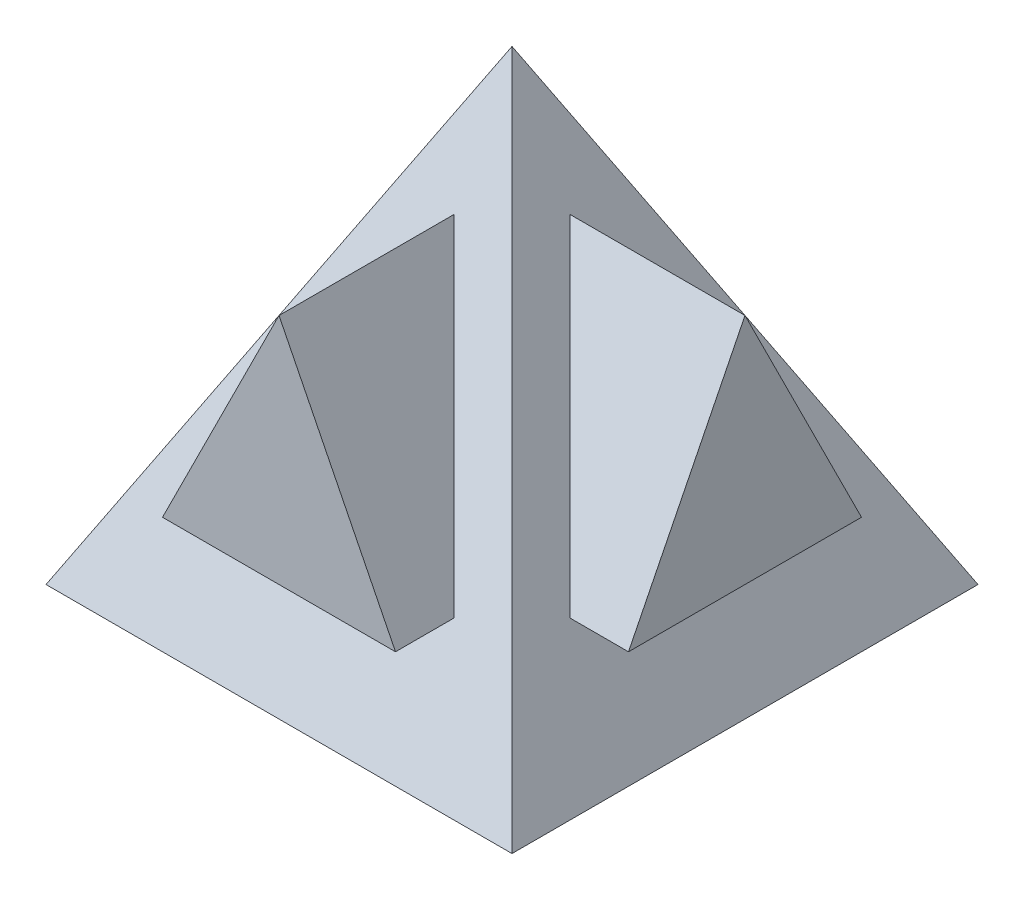
ISO-10303-21;
HEADER;
FILE_DESCRIPTION(('STEP AP214'),'2;1');
FILE_NAME('part.step','',(''),(''),'','','');
FILE_SCHEMA(('AUTOMOTIVE_DESIGN { 1 0 10303 214 1 1 1 1 }'));
ENDSEC;
DATA;
#1=APPLICATION_CONTEXT('core data for automotive mechanical design processes');
#2=APPLICATION_PROTOCOL_DEFINITION('international standard','automotive_design',2000,#1);
#3=PRODUCT_CONTEXT('',#1,'mechanical');
#4=PRODUCT('Part','Part','',(#3));
#5=PRODUCT_RELATED_PRODUCT_CATEGORY('part','',(#4));
#6=PRODUCT_DEFINITION_FORMATION('','',#4);
#7=PRODUCT_DEFINITION_CONTEXT('part definition',#1,'design');
#8=PRODUCT_DEFINITION('design','',#6,#7);
#9=PRODUCT_DEFINITION_SHAPE('','',#8);
#10=(LENGTH_UNIT() NAMED_UNIT(*) SI_UNIT(.MILLI.,.METRE.));
#11=(NAMED_UNIT(*) PLANE_ANGLE_UNIT() SI_UNIT($,.RADIAN.));
#12=(NAMED_UNIT(*) SI_UNIT($,.STERADIAN.) SOLID_ANGLE_UNIT());
#13=UNCERTAINTY_MEASURE_WITH_UNIT(LENGTH_MEASURE(1.E-05),#10,'distance_accuracy_value','');
#14=(GEOMETRIC_REPRESENTATION_CONTEXT(3) GLOBAL_UNCERTAINTY_ASSIGNED_CONTEXT((#13)) GLOBAL_UNIT_ASSIGNED_CONTEXT((#10,
#11,#12)) REPRESENTATION_CONTEXT('',''));
#15=CARTESIAN_POINT('',(0.,0.,0.));
#16=DIRECTION('',(0.,0.,1.));
#17=DIRECTION('',(1.,0.,0.));
#18=AXIS2_PLACEMENT_3D('',#15,#16,#17);
#19=CARTESIAN_POINT('',(0.,40.64,81.28));
#20=DIRECTION('',(0.,0.447213595499958,0.894427190999916));
#21=DIRECTION('',(0.,-0.894427190999916,0.447213595499958));
#22=AXIS2_PLACEMENT_3D('',#19,#20,#21);
#23=PLANE('',#22);
#24=DIRECTION('',(-0.408248290463863,-0.816496580927726,0.408248290463863));
#25=VECTOR('',#24,1.);
#26=CARTESIAN_POINT('',(0.,203.2,0.));
#27=LINE('',#26,#25);
#28=CARTESIAN_POINT('',(0.,203.2,0.));
#29=VERTEX_POINT('',#28);
#30=CARTESIAN_POINT('',(-101.6,0.,101.6));
#31=VERTEX_POINT('',#30);
#32=EDGE_CURVE('E163',#29,#31,#27,.T.);
#33=ORIENTED_EDGE('',*,*,#32,.T.);
#34=DIRECTION('',(1.,0.,0.));
#35=VECTOR('',#34,1.);
#36=CARTESIAN_POINT('',(101.6,0.,101.6));
#37=LINE('',#36,#35);
#38=CARTESIAN_POINT('',(101.6,0.,101.6));
#39=VERTEX_POINT('',#38);
#40=EDGE_CURVE('E157',#31,#39,#37,.T.);
#41=ORIENTED_EDGE('',*,*,#40,.T.);
#42=DIRECTION('',(0.408248290463863,-0.816496580927726,0.408248290463863));
#43=VECTOR('',#42,1.);
#44=CARTESIAN_POINT('',(0.,203.2,0.));
#45=LINE('',#44,#43);
#46=EDGE_CURVE('E151',#29,#39,#45,.T.);
#47=ORIENTED_EDGE('',*,*,#46,.F.);
#48=EDGE_LOOP('',(#33,#41,#47));
#49=FACE_BOUND('',#48,.T.);
#50=DIRECTION('',(0.408248290463863,0.816496580927726,-0.408248290463863));
#51=VECTOR('',#50,1.);
#52=CARTESIAN_POINT('',(-46.5666666666666,59.2666666666667,71.9666666666667));
#53=LINE('',#52,#51);
#54=CARTESIAN_POINT('',(-50.8,50.8,76.2));
#55=VERTEX_POINT('',#54);
#56=CARTESIAN_POINT('',(0.,152.4,25.4));
#57=VERTEX_POINT('',#56);
#58=EDGE_CURVE('E50',#55,#57,#53,.T.);
#59=ORIENTED_EDGE('',*,*,#58,.T.);
#60=DIRECTION('',(0.408248290463863,-0.816496580927726,0.408248290463863));
#61=VECTOR('',#60,1.);
#62=CARTESIAN_POINT('',(46.5666666666667,59.2666666666667,71.9666666666667));
#63=LINE('',#62,#61);
#64=CARTESIAN_POINT('',(50.8,50.8,76.2));
#65=VERTEX_POINT('',#64);
#66=EDGE_CURVE('E12',#57,#65,#63,.T.);
#67=ORIENTED_EDGE('',*,*,#66,.T.);
#68=DIRECTION('',(-1.,0.,0.));
#69=VECTOR('',#68,1.);
#70=CARTESIAN_POINT('',(0.,50.8,76.2));
#71=LINE('',#70,#69);
#72=EDGE_CURVE('E148',#65,#55,#71,.T.);
#73=ORIENTED_EDGE('',*,*,#72,.T.);
#74=EDGE_LOOP('',(#59,#67,#73));
#75=FACE_BOUND('',#74,.T.);
#76=ADVANCED_FACE('F41',(#49,#75),#23,.T.);
#77=CARTESIAN_POINT('',(81.28,40.64,0.));
#78=DIRECTION('',(0.894427190999916,0.447213595499958,0.));
#79=DIRECTION('',(-0.447213595499958,0.894427190999916,0.));
#80=AXIS2_PLACEMENT_3D('',#77,#78,#79);
#81=PLANE('',#80);
#82=ORIENTED_EDGE('',*,*,#46,.T.);
#83=DIRECTION('',(0.,0.,-1.));
#84=VECTOR('',#83,1.);
#85=CARTESIAN_POINT('',(101.6,0.,101.6));
#86=LINE('',#85,#84);
#87=CARTESIAN_POINT('',(101.6,0.,-101.6));
#88=VERTEX_POINT('',#87);
#89=EDGE_CURVE('E199',#39,#88,#86,.T.);
#90=ORIENTED_EDGE('',*,*,#89,.T.);
#91=DIRECTION('',(0.408248290463863,-0.816496580927726,-0.408248290463863));
#92=VECTOR('',#91,1.);
#93=CARTESIAN_POINT('',(0.,203.2,0.));
#94=LINE('',#93,#92);
#95=EDGE_CURVE('E186',#29,#88,#94,.T.);
#96=ORIENTED_EDGE('',*,*,#95,.F.);
#97=EDGE_LOOP('',(#82,#90,#96));
#98=FACE_BOUND('',#97,.T.);
#99=DIRECTION('',(0.408248290463863,-0.816496580927725,-0.408248290463864));
#100=VECTOR('',#99,1.);
#101=CARTESIAN_POINT('',(71.9666666666666,59.2666666666668,-46.5666666666668));
#102=LINE('',#101,#100);
#103=CARTESIAN_POINT('',(25.4,152.4,0.));
#104=VERTEX_POINT('',#103);
#105=CARTESIAN_POINT('',(76.2,50.8,-50.8000000000003));
#106=VERTEX_POINT('',#105);
#107=EDGE_CURVE('E129',#104,#106,#102,.T.);
#108=ORIENTED_EDGE('',*,*,#107,.T.);
#109=DIRECTION('',(0.,0.,1.));
#110=VECTOR('',#109,1.);
#111=CARTESIAN_POINT('',(76.2,50.8,0.));
#112=LINE('',#111,#110);
#113=CARTESIAN_POINT('',(76.2,50.8,50.7999999999997));
#114=VERTEX_POINT('',#113);
#115=EDGE_CURVE('E269',#106,#114,#112,.T.);
#116=ORIENTED_EDGE('',*,*,#115,.T.);
#117=DIRECTION('',(-0.408248290463863,0.816496580927727,-0.408248290463862));
#118=VECTOR('',#117,1.);
#119=CARTESIAN_POINT('',(71.9666666666668,59.2666666666665,46.5666666666665));
#120=LINE('',#119,#118);
#121=EDGE_CURVE('E267',#114,#104,#120,.T.);
#122=ORIENTED_EDGE('',*,*,#121,.T.);
#123=EDGE_LOOP('',(#108,#116,#122));
#124=FACE_BOUND('',#123,.T.);
#125=ADVANCED_FACE('F43',(#98,#124),#81,.T.);
#126=CARTESIAN_POINT('',(0.,0.,0.));
#127=DIRECTION('',(0.,1.,0.));
#128=DIRECTION('',(0.,0.,1.));
#129=AXIS2_PLACEMENT_3D('',#126,#127,#128);
#130=PLANE('',#129);
#131=DIRECTION('',(0.,0.,1.));
#132=VECTOR('',#131,1.);
#133=CARTESIAN_POINT('',(-101.6,0.,101.6));
#134=LINE('',#133,#132);
#135=CARTESIAN_POINT('',(-101.6,0.,-101.6));
#136=VERTEX_POINT('',#135);
#137=EDGE_CURVE('E254',#136,#31,#134,.T.);
#138=ORIENTED_EDGE('',*,*,#137,.F.);
#139=DIRECTION('',(-1.,0.,0.));
#140=VECTOR('',#139,1.);
#141=CARTESIAN_POINT('',(101.6,0.,-101.6));
#142=LINE('',#141,#140);
#143=EDGE_CURVE('E247',#88,#136,#142,.T.);
#144=ORIENTED_EDGE('',*,*,#143,.F.);
#145=ORIENTED_EDGE('',*,*,#89,.F.);
#146=ORIENTED_EDGE('',*,*,#40,.F.);
#147=EDGE_LOOP('',(#138,#144,#145,#146));
#148=FACE_BOUND('',#147,.T.);
#149=ADVANCED_FACE('F224',(#148),#130,.F.);
#150=CARTESIAN_POINT('',(-81.28,40.64,0.));
#151=DIRECTION('',(-0.894427190999916,0.447213595499958,0.));
#152=DIRECTION('',(-0.447213595499958,-0.894427190999916,0.));
#153=AXIS2_PLACEMENT_3D('',#150,#151,#152);
#154=PLANE('',#153);
#155=DIRECTION('',(-0.408248290463863,-0.816496580927726,-0.408248290463863));
#156=VECTOR('',#155,1.);
#157=CARTESIAN_POINT('',(0.,203.2,0.));
#158=LINE('',#157,#156);
#159=EDGE_CURVE('E194',#29,#136,#158,.T.);
#160=ORIENTED_EDGE('',*,*,#159,.T.);
#161=ORIENTED_EDGE('',*,*,#137,.T.);
#162=ORIENTED_EDGE('',*,*,#32,.F.);
#163=EDGE_LOOP('',(#160,#161,#162));
#164=FACE_BOUND('',#163,.T.);
#165=ADVANCED_FACE('F173',(#164),#154,.T.);
#166=CARTESIAN_POINT('',(0.,40.64,-81.28));
#167=DIRECTION('',(0.,0.447213595499958,-0.894427190999916));
#168=DIRECTION('',(0.,0.894427190999916,0.447213595499958));
#169=AXIS2_PLACEMENT_3D('',#166,#167,#168);
#170=PLANE('',#169);
#171=ORIENTED_EDGE('',*,*,#95,.T.);
#172=ORIENTED_EDGE('',*,*,#143,.T.);
#173=ORIENTED_EDGE('',*,*,#159,.F.);
#174=EDGE_LOOP('',(#171,#172,#173));
#175=FACE_BOUND('',#174,.T.);
#176=ADVANCED_FACE('F176',(#175),#170,.T.);
#177=CARTESIAN_POINT('',(101.6,0.,-3.54734504026462E-13));
#178=DIRECTION('',(-1.,0.,0.));
#179=DIRECTION('',(0.,0.,1.));
#180=AXIS2_PLACEMENT_3D('',#177,#178,#179);
#181=PLANE('',#180);
#182=DIRECTION('',(0.,0.894427190999916,0.447213595499958));
#183=VECTOR('',#182,1.);
#184=CARTESIAN_POINT('',(101.6,50.8,-50.8000000000004));
#185=LINE('',#184,#183);
#186=CARTESIAN_POINT('',(101.6,50.8,-50.8000000000004));
#187=VERTEX_POINT('',#186);
#188=CARTESIAN_POINT('',(101.6,152.4,-3.5656878734471E-13));
#189=VERTEX_POINT('',#188);
#190=EDGE_CURVE('E123',#187,#189,#185,.T.);
#191=ORIENTED_EDGE('',*,*,#190,.T.);
#192=DIRECTION('',(0.,-0.894427190999916,0.447213595499958));
#193=VECTOR('',#192,1.);
#194=CARTESIAN_POINT('',(101.6,152.4,-3.5656878734471E-13));
#195=LINE('',#194,#193);
#196=CARTESIAN_POINT('',(101.6,50.8,50.7999999999996));
#197=VERTEX_POINT('',#196);
#198=EDGE_CURVE('E112',#189,#197,#195,.T.);
#199=ORIENTED_EDGE('',*,*,#198,.T.);
#200=DIRECTION('',(0.,0.,-1.));
#201=VECTOR('',#200,1.);
#202=CARTESIAN_POINT('',(101.6,50.8,50.7999999999996));
#203=LINE('',#202,#201);
#204=EDGE_CURVE('E122',#197,#187,#203,.T.);
#205=ORIENTED_EDGE('',*,*,#204,.T.);
#206=EDGE_LOOP('',(#191,#199,#205));
#207=FACE_BOUND('',#206,.T.);
#208=ADVANCED_FACE('F125',(#207),#181,.F.);
#209=CARTESIAN_POINT('',(101.6,50.8,-50.8000000000004));
#210=DIRECTION('',(0.,-0.447213595499958,0.894427190999916));
#211=DIRECTION('',(0.,-0.894427190999916,-0.447213595499958));
#212=AXIS2_PLACEMENT_3D('',#209,#210,#211);
#213=PLANE('',#212);
#214=ORIENTED_EDGE('',*,*,#107,.F.);
#215=DIRECTION('',(-1.,0.,0.));
#216=VECTOR('',#215,1.);
#217=CARTESIAN_POINT('',(101.6,152.4,-3.5656878734471E-13));
#218=LINE('',#217,#216);
#219=EDGE_CURVE('E116',#189,#104,#218,.T.);
#220=ORIENTED_EDGE('',*,*,#219,.F.);
#221=ORIENTED_EDGE('',*,*,#190,.F.);
#222=DIRECTION('',(-1.,0.,0.));
#223=VECTOR('',#222,1.);
#224=CARTESIAN_POINT('',(101.6,50.8,-50.8000000000004));
#225=LINE('',#224,#223);
#226=EDGE_CURVE('E65',#187,#106,#225,.T.);
#227=ORIENTED_EDGE('',*,*,#226,.T.);
#228=EDGE_LOOP('',(#214,#220,#221,#227));
#229=FACE_BOUND('',#228,.T.);
#230=ADVANCED_FACE('F127',(#229),#213,.F.);
#231=CARTESIAN_POINT('',(101.6,152.4,-3.5656878734471E-13));
#232=DIRECTION('',(0.,-0.447213595499958,-0.894427190999916));
#233=DIRECTION('',(0.,0.894427190999916,-0.447213595499958));
#234=AXIS2_PLACEMENT_3D('',#231,#232,#233);
#235=PLANE('',#234);
#236=ORIENTED_EDGE('',*,*,#121,.F.);
#237=DIRECTION('',(-1.,0.,0.));
#238=VECTOR('',#237,1.);
#239=CARTESIAN_POINT('',(101.6,50.8,50.7999999999996));
#240=LINE('',#239,#238);
#241=EDGE_CURVE('E119',#197,#114,#240,.T.);
#242=ORIENTED_EDGE('',*,*,#241,.F.);
#243=ORIENTED_EDGE('',*,*,#198,.F.);
#244=ORIENTED_EDGE('',*,*,#219,.T.);
#245=EDGE_LOOP('',(#236,#242,#243,#244));
#246=FACE_BOUND('',#245,.T.);
#247=ADVANCED_FACE('F114',(#246),#235,.F.);
#248=CARTESIAN_POINT('',(-50.8,50.8,101.6));
#249=DIRECTION('',(0.,1.,0.));
#250=DIRECTION('',(0.,0.,1.));
#251=AXIS2_PLACEMENT_3D('',#248,#249,#250);
#252=PLANE('',#251);
#253=ORIENTED_EDGE('',*,*,#115,.F.);
#254=ORIENTED_EDGE('',*,*,#226,.F.);
#255=ORIENTED_EDGE('',*,*,#204,.F.);
#256=ORIENTED_EDGE('',*,*,#241,.T.);
#257=EDGE_LOOP('',(#253,#254,#255,#256));
#258=FACE_BOUND('',#257,.T.);
#259=ADVANCED_FACE('F290',(#258),#252,.F.);
#260=ORIENTED_EDGE('',*,*,#72,.F.);
#261=DIRECTION('',(0.,0.,-1.));
#262=VECTOR('',#261,1.);
#263=CARTESIAN_POINT('',(50.8,50.8,101.6));
#264=LINE('',#263,#262);
#265=CARTESIAN_POINT('',(50.8,50.8,101.6));
#266=VERTEX_POINT('',#265);
#267=EDGE_CURVE('E141',#266,#65,#264,.T.);
#268=ORIENTED_EDGE('',*,*,#267,.F.);
#269=DIRECTION('',(1.,0.,0.));
#270=VECTOR('',#269,1.);
#271=CARTESIAN_POINT('',(-50.8,50.8,101.6));
#272=LINE('',#271,#270);
#273=CARTESIAN_POINT('',(-50.8,50.8,101.6));
#274=VERTEX_POINT('',#273);
#275=EDGE_CURVE('E139',#274,#266,#272,.T.);
#276=ORIENTED_EDGE('',*,*,#275,.F.);
#277=DIRECTION('',(0.,0.,-1.));
#278=VECTOR('',#277,1.);
#279=CARTESIAN_POINT('',(-50.8,50.8,101.6));
#280=LINE('',#279,#278);
#281=EDGE_CURVE('E57',#274,#55,#280,.T.);
#282=ORIENTED_EDGE('',*,*,#281,.T.);
#283=EDGE_LOOP('',(#260,#268,#276,#282));
#284=FACE_BOUND('',#283,.T.);
#285=ADVANCED_FACE('F279',(#284),#252,.F.);
#286=CARTESIAN_POINT('',(50.8,50.8,101.6));
#287=DIRECTION('',(-0.894427190999916,-0.447213595499958,0.));
#288=DIRECTION('',(0.447213595499958,-0.894427190999916,0.));
#289=AXIS2_PLACEMENT_3D('',#286,#287,#288);
#290=PLANE('',#289);
#291=ORIENTED_EDGE('',*,*,#66,.F.);
#292=DIRECTION('',(0.,0.,-1.));
#293=VECTOR('',#292,1.);
#294=CARTESIAN_POINT('',(0.,152.4,101.6));
#295=LINE('',#294,#293);
#296=CARTESIAN_POINT('',(0.,152.4,101.6));
#297=VERTEX_POINT('',#296);
#298=EDGE_CURVE('E145',#297,#57,#295,.T.);
#299=ORIENTED_EDGE('',*,*,#298,.F.);
#300=DIRECTION('',(-0.447213595499958,0.894427190999916,0.));
#301=VECTOR('',#300,1.);
#302=CARTESIAN_POINT('',(50.8,50.8,101.6));
#303=LINE('',#302,#301);
#304=EDGE_CURVE('E130',#266,#297,#303,.T.);
#305=ORIENTED_EDGE('',*,*,#304,.F.);
#306=ORIENTED_EDGE('',*,*,#267,.T.);
#307=EDGE_LOOP('',(#291,#299,#305,#306));
#308=FACE_BOUND('',#307,.T.);
#309=ADVANCED_FACE('F233',(#308),#290,.F.);
#310=CARTESIAN_POINT('',(0.,152.4,101.6));
#311=DIRECTION('',(0.894427190999916,-0.447213595499958,0.));
#312=DIRECTION('',(0.447213595499958,0.894427190999916,0.));
#313=AXIS2_PLACEMENT_3D('',#310,#311,#312);
#314=PLANE('',#313);
#315=ORIENTED_EDGE('',*,*,#58,.F.);
#316=ORIENTED_EDGE('',*,*,#281,.F.);
#317=DIRECTION('',(-0.447213595499958,-0.894427190999916,0.));
#318=VECTOR('',#317,1.);
#319=CARTESIAN_POINT('',(0.,152.4,101.6));
#320=LINE('',#319,#318);
#321=EDGE_CURVE('E133',#297,#274,#320,.T.);
#322=ORIENTED_EDGE('',*,*,#321,.F.);
#323=ORIENTED_EDGE('',*,*,#298,.T.);
#324=EDGE_LOOP('',(#315,#316,#322,#323));
#325=FACE_BOUND('',#324,.T.);
#326=ADVANCED_FACE('F274',(#325),#314,.F.);
#327=CARTESIAN_POINT('',(0.,0.,101.6));
#328=DIRECTION('',(0.,0.,-1.));
#329=DIRECTION('',(-1.,0.,0.));
#330=AXIS2_PLACEMENT_3D('',#327,#328,#329);
#331=PLANE('',#330);
#332=ORIENTED_EDGE('',*,*,#304,.T.);
#333=ORIENTED_EDGE('',*,*,#321,.T.);
#334=ORIENTED_EDGE('',*,*,#275,.T.);
#335=EDGE_LOOP('',(#332,#333,#334));
#336=FACE_BOUND('',#335,.T.);
#337=ADVANCED_FACE('F281',(#336),#331,.F.);
#338=CLOSED_SHELL('',(#76,#125,#149,#165,#176,#208,#230,#247,#259,#285,#309,#326,#337));
#339=MANIFOLD_SOLID_BREP('B2',#338);
#340=ADVANCED_BREP_SHAPE_REPRESENTATION('',(#18,#339),#14);
#341=SHAPE_DEFINITION_REPRESENTATION(#9,#340);
ENDSEC;
END-ISO-10303-21;
